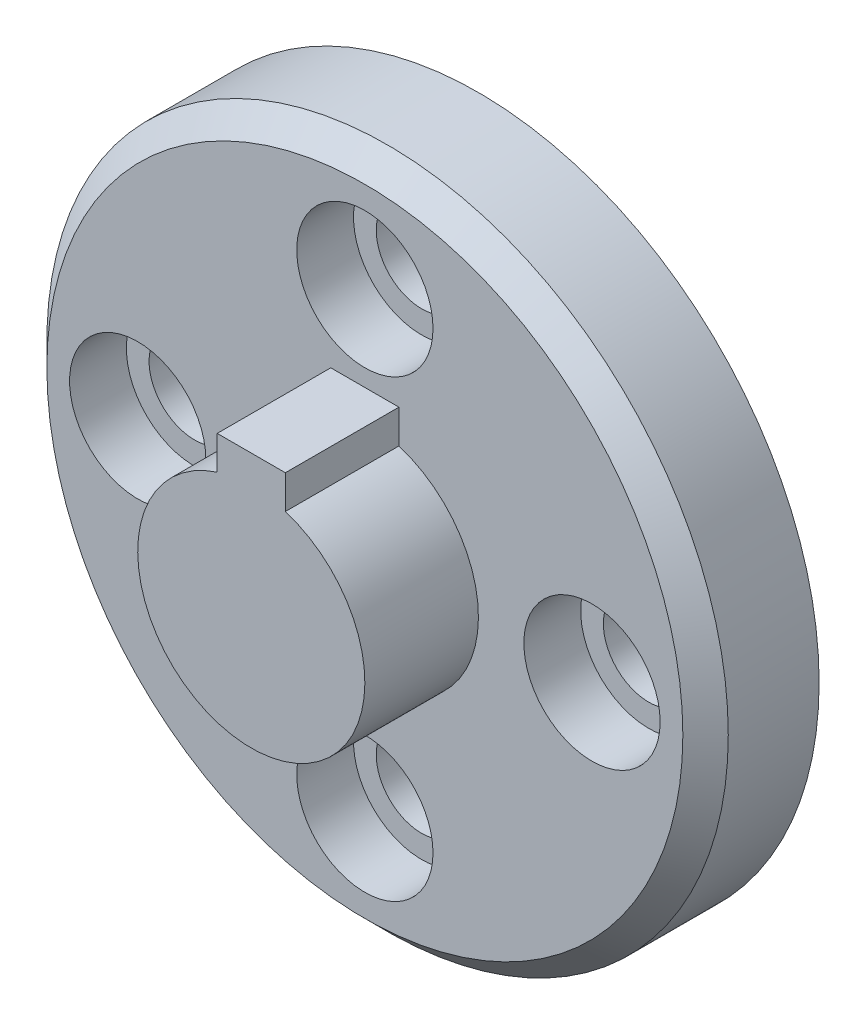
ISO-10303-21;
HEADER;
FILE_DESCRIPTION(('STEP AP214'),'2;1');
FILE_NAME('part.step','',(''),(''),'','','');
FILE_SCHEMA(('AUTOMOTIVE_DESIGN { 1 0 10303 214 1 1 1 1 }'));
ENDSEC;
DATA;
#1=APPLICATION_CONTEXT('core data for automotive mechanical design processes');
#2=APPLICATION_PROTOCOL_DEFINITION('international standard','automotive_design',2000,#1);
#3=PRODUCT_CONTEXT('',#1,'mechanical');
#4=PRODUCT('Part','Part','',(#3));
#5=PRODUCT_RELATED_PRODUCT_CATEGORY('part','',(#4));
#6=PRODUCT_DEFINITION_FORMATION('','',#4);
#7=PRODUCT_DEFINITION_CONTEXT('part definition',#1,'design');
#8=PRODUCT_DEFINITION('design','',#6,#7);
#9=PRODUCT_DEFINITION_SHAPE('','',#8);
#10=(LENGTH_UNIT() NAMED_UNIT(*) SI_UNIT(.MILLI.,.METRE.));
#11=(NAMED_UNIT(*) PLANE_ANGLE_UNIT() SI_UNIT($,.RADIAN.));
#12=(NAMED_UNIT(*) SI_UNIT($,.STERADIAN.) SOLID_ANGLE_UNIT());
#13=UNCERTAINTY_MEASURE_WITH_UNIT(LENGTH_MEASURE(1.E-05),#10,'distance_accuracy_value','');
#14=(GEOMETRIC_REPRESENTATION_CONTEXT(3) GLOBAL_UNCERTAINTY_ASSIGNED_CONTEXT((#13)) GLOBAL_UNIT_ASSIGNED_CONTEXT((#10,
#11,#12)) REPRESENTATION_CONTEXT('',''));
#15=CARTESIAN_POINT('',(0.,0.,0.));
#16=DIRECTION('',(0.,0.,1.));
#17=DIRECTION('',(1.,0.,0.));
#18=AXIS2_PLACEMENT_3D('',#15,#16,#17);
#19=CARTESIAN_POINT('',(0.,10.,5.));
#20=DIRECTION('',(0.,0.,-1.));
#21=DIRECTION('',(-1.,0.,0.));
#22=AXIS2_PLACEMENT_3D('',#19,#20,#21);
#23=CYLINDRICAL_SURFACE('',#22,2.);
#24=CARTESIAN_POINT('',(0.,10.,0.));
#25=DIRECTION('',(0.,0.,1.));
#26=DIRECTION('',(1.,0.,0.));
#27=AXIS2_PLACEMENT_3D('',#24,#25,#26);
#28=CIRCLE('',#27,2.);
#29=CARTESIAN_POINT('',(2.,10.,0.));
#30=VERTEX_POINT('',#29);
#31=EDGE_CURVE('E150',#30,#30,#28,.T.);
#32=ORIENTED_EDGE('',*,*,#31,.F.);
#33=EDGE_LOOP('',(#32));
#34=FACE_BOUND('',#33,.T.);
#35=CARTESIAN_POINT('',(0.,10.,2.5));
#36=DIRECTION('',(0.,0.,1.));
#37=DIRECTION('',(1.,0.,0.));
#38=AXIS2_PLACEMENT_3D('',#35,#36,#37);
#39=CIRCLE('',#38,2.);
#40=CARTESIAN_POINT('',(2.,10.,2.5));
#41=VERTEX_POINT('',#40);
#42=EDGE_CURVE('E124',#41,#41,#39,.T.);
#43=ORIENTED_EDGE('',*,*,#42,.T.);
#44=EDGE_LOOP('',(#43));
#45=FACE_BOUND('',#44,.T.);
#46=ADVANCED_FACE('F47',(#34,#45),#23,.F.);
#47=CARTESIAN_POINT('',(10.,0.,5.));
#48=DIRECTION('',(0.,0.,-1.));
#49=DIRECTION('',(-1.,0.,0.));
#50=AXIS2_PLACEMENT_3D('',#47,#48,#49);
#51=CYLINDRICAL_SURFACE('',#50,2.);
#52=CARTESIAN_POINT('',(10.,0.,0.));
#53=DIRECTION('',(0.,0.,1.));
#54=DIRECTION('',(1.,0.,0.));
#55=AXIS2_PLACEMENT_3D('',#52,#53,#54);
#56=CIRCLE('',#55,2.);
#57=CARTESIAN_POINT('',(12.,0.,0.));
#58=VERTEX_POINT('',#57);
#59=EDGE_CURVE('E146',#58,#58,#56,.T.);
#60=ORIENTED_EDGE('',*,*,#59,.F.);
#61=EDGE_LOOP('',(#60));
#62=FACE_BOUND('',#61,.T.);
#63=CARTESIAN_POINT('',(10.,0.,2.5));
#64=DIRECTION('',(0.,0.,1.));
#65=DIRECTION('',(1.,0.,0.));
#66=AXIS2_PLACEMENT_3D('',#63,#64,#65);
#67=CIRCLE('',#66,2.);
#68=CARTESIAN_POINT('',(12.,0.,2.5));
#69=VERTEX_POINT('',#68);
#70=EDGE_CURVE('E167',#69,#69,#67,.T.);
#71=ORIENTED_EDGE('',*,*,#70,.T.);
#72=EDGE_LOOP('',(#71));
#73=FACE_BOUND('',#72,.T.);
#74=ADVANCED_FACE('F192',(#62,#73),#51,.F.);
#75=CARTESIAN_POINT('',(0.,-10.,5.));
#76=DIRECTION('',(0.,0.,-1.));
#77=DIRECTION('',(-1.,0.,0.));
#78=AXIS2_PLACEMENT_3D('',#75,#76,#77);
#79=CYLINDRICAL_SURFACE('',#78,2.);
#80=CARTESIAN_POINT('',(0.,-10.,0.));
#81=DIRECTION('',(0.,0.,1.));
#82=DIRECTION('',(1.,0.,0.));
#83=AXIS2_PLACEMENT_3D('',#80,#81,#82);
#84=CIRCLE('',#83,2.);
#85=CARTESIAN_POINT('',(1.99999999999993,-10.,0.));
#86=VERTEX_POINT('',#85);
#87=EDGE_CURVE('E142',#86,#86,#84,.T.);
#88=ORIENTED_EDGE('',*,*,#87,.F.);
#89=EDGE_LOOP('',(#88));
#90=FACE_BOUND('',#89,.T.);
#91=CARTESIAN_POINT('',(0.,-10.,2.5));
#92=DIRECTION('',(0.,0.,1.));
#93=DIRECTION('',(1.,0.,0.));
#94=AXIS2_PLACEMENT_3D('',#91,#92,#93);
#95=CIRCLE('',#94,2.);
#96=CARTESIAN_POINT('',(1.99999999999993,-10.,2.5));
#97=VERTEX_POINT('',#96);
#98=EDGE_CURVE('E162',#97,#97,#95,.T.);
#99=ORIENTED_EDGE('',*,*,#98,.T.);
#100=EDGE_LOOP('',(#99));
#101=FACE_BOUND('',#100,.T.);
#102=ADVANCED_FACE('F199',(#90,#101),#79,.F.);
#103=CARTESIAN_POINT('',(-10.,1.04744440165294E-13,5.));
#104=DIRECTION('',(0.,0.,-1.));
#105=DIRECTION('',(-1.,0.,0.));
#106=AXIS2_PLACEMENT_3D('',#103,#104,#105);
#107=CYLINDRICAL_SURFACE('',#106,2.);
#108=CARTESIAN_POINT('',(-10.,1.04744440165294E-13,0.));
#109=DIRECTION('',(0.,0.,1.));
#110=DIRECTION('',(1.,0.,0.));
#111=AXIS2_PLACEMENT_3D('',#108,#109,#110);
#112=CIRCLE('',#111,2.);
#113=CARTESIAN_POINT('',(-8.,1.04744440165294E-13,0.));
#114=VERTEX_POINT('',#113);
#115=EDGE_CURVE('E138',#114,#114,#112,.T.);
#116=ORIENTED_EDGE('',*,*,#115,.F.);
#117=EDGE_LOOP('',(#116));
#118=FACE_BOUND('',#117,.T.);
#119=CARTESIAN_POINT('',(-10.,1.04744440165294E-13,2.5));
#120=DIRECTION('',(0.,0.,1.));
#121=DIRECTION('',(1.,0.,0.));
#122=AXIS2_PLACEMENT_3D('',#119,#120,#121);
#123=CIRCLE('',#122,2.);
#124=CARTESIAN_POINT('',(-8.,1.04744440165294E-13,2.5));
#125=VERTEX_POINT('',#124);
#126=EDGE_CURVE('E158',#125,#125,#123,.T.);
#127=ORIENTED_EDGE('',*,*,#126,.T.);
#128=EDGE_LOOP('',(#127));
#129=FACE_BOUND('',#128,.T.);
#130=ADVANCED_FACE('F209',(#118,#129),#107,.F.);
#131=CARTESIAN_POINT('',(0.,0.,5.));
#132=DIRECTION('',(0.,0.,1.));
#133=DIRECTION('',(1.,0.,0.));
#134=AXIS2_PLACEMENT_3D('',#131,#132,#133);
#135=PLANE('',#134);
#136=CARTESIAN_POINT('',(0.,0.,5.));
#137=DIRECTION('',(0.,0.,1.));
#138=DIRECTION('',(1.,0.,0.));
#139=AXIS2_PLACEMENT_3D('',#136,#137,#138);
#140=CIRCLE('',#139,14.);
#141=CARTESIAN_POINT('',(14.,0.,5.));
#142=VERTEX_POINT('',#141);
#143=EDGE_CURVE('E57',#142,#142,#140,.T.);
#144=ORIENTED_EDGE('',*,*,#143,.T.);
#145=EDGE_LOOP('',(#144));
#146=FACE_BOUND('',#145,.T.);
#147=CARTESIAN_POINT('',(-10.,1.04744440165294E-13,5.));
#148=DIRECTION('',(0.,0.,1.));
#149=DIRECTION('',(1.,0.,0.));
#150=AXIS2_PLACEMENT_3D('',#147,#148,#149);
#151=CIRCLE('',#150,3.);
#152=CARTESIAN_POINT('',(-7.,1.04744440165294E-13,5.));
#153=VERTEX_POINT('',#152);
#154=EDGE_CURVE('E245',#153,#153,#151,.T.);
#155=ORIENTED_EDGE('',*,*,#154,.F.);
#156=EDGE_LOOP('',(#155));
#157=FACE_BOUND('',#156,.T.);
#158=CARTESIAN_POINT('',(1.41393977029702E-13,10.,5.));
#159=DIRECTION('',(0.,0.,1.));
#160=DIRECTION('',(1.,0.,0.));
#161=AXIS2_PLACEMENT_3D('',#158,#159,#160);
#162=CIRCLE('',#161,3.);
#163=CARTESIAN_POINT('',(3.00000000000014,10.,5.));
#164=VERTEX_POINT('',#163);
#165=EDGE_CURVE('E249',#164,#164,#162,.T.);
#166=ORIENTED_EDGE('',*,*,#165,.F.);
#167=EDGE_LOOP('',(#166));
#168=FACE_BOUND('',#167,.T.);
#169=CARTESIAN_POINT('',(10.,-1.74574066942157E-13,5.));
#170=DIRECTION('',(0.,0.,1.));
#171=DIRECTION('',(1.,0.,0.));
#172=AXIS2_PLACEMENT_3D('',#169,#170,#171);
#173=CIRCLE('',#172,3.);
#174=CARTESIAN_POINT('',(13.,-1.74574066942157E-13,5.));
#175=VERTEX_POINT('',#174);
#176=EDGE_CURVE('E259',#175,#175,#173,.T.);
#177=ORIENTED_EDGE('',*,*,#176,.F.);
#178=EDGE_LOOP('',(#177));
#179=FACE_BOUND('',#178,.T.);
#180=CARTESIAN_POINT('',(-2.11223603806565E-13,-10.,5.));
#181=DIRECTION('',(0.,0.,1.));
#182=DIRECTION('',(1.,0.,0.));
#183=AXIS2_PLACEMENT_3D('',#180,#181,#182);
#184=CIRCLE('',#183,3.);
#185=CARTESIAN_POINT('',(2.99999999999979,-10.,5.));
#186=VERTEX_POINT('',#185);
#187=EDGE_CURVE('E267',#186,#186,#184,.T.);
#188=ORIENTED_EDGE('',*,*,#187,.F.);
#189=EDGE_LOOP('',(#188));
#190=FACE_BOUND('',#189,.T.);
#191=DIRECTION('',(0.,1.,0.));
#192=VECTOR('',#191,1.);
#193=CARTESIAN_POINT('',(1.5,6.25,5.));
#194=LINE('',#193,#192);
#195=CARTESIAN_POINT('',(1.5,4.76969600708473,5.));
#196=VERTEX_POINT('',#195);
#197=CARTESIAN_POINT('',(1.5,6.25,5.));
#198=VERTEX_POINT('',#197);
#199=EDGE_CURVE('E106',#196,#198,#194,.T.);
#200=ORIENTED_EDGE('',*,*,#199,.F.);
#201=CARTESIAN_POINT('',(0.,0.,5.));
#202=DIRECTION('',(0.,0.,1.));
#203=DIRECTION('',(1.,0.,0.));
#204=AXIS2_PLACEMENT_3D('',#201,#202,#203);
#205=CIRCLE('',#204,5.);
#206=CARTESIAN_POINT('',(-1.5,4.76969600708473,5.));
#207=VERTEX_POINT('',#206);
#208=EDGE_CURVE('E120',#207,#196,#205,.T.);
#209=ORIENTED_EDGE('',*,*,#208,.F.);
#210=DIRECTION('',(0.,-1.,0.));
#211=VECTOR('',#210,1.);
#212=CARTESIAN_POINT('',(-1.5,6.25,5.));
#213=LINE('',#212,#211);
#214=CARTESIAN_POINT('',(-1.5,6.25,5.));
#215=VERTEX_POINT('',#214);
#216=EDGE_CURVE('E86',#215,#207,#213,.T.);
#217=ORIENTED_EDGE('',*,*,#216,.F.);
#218=DIRECTION('',(-1.,0.,0.));
#219=VECTOR('',#218,1.);
#220=CARTESIAN_POINT('',(-1.5,6.25,5.));
#221=LINE('',#220,#219);
#222=EDGE_CURVE('E127',#198,#215,#221,.T.);
#223=ORIENTED_EDGE('',*,*,#222,.F.);
#224=EDGE_LOOP('',(#200,#209,#217,#223));
#225=FACE_BOUND('',#224,.T.);
#226=ADVANCED_FACE('F177',(#146,#157,#168,#179,#190,#225),#135,.T.);
#227=CARTESIAN_POINT('',(0.,0.,0.));
#228=DIRECTION('',(0.,0.,1.));
#229=DIRECTION('',(1.,0.,0.));
#230=AXIS2_PLACEMENT_3D('',#227,#228,#229);
#231=PLANE('',#230);
#232=CARTESIAN_POINT('',(0.,0.,0.));
#233=DIRECTION('',(0.,0.,1.));
#234=DIRECTION('',(1.,0.,0.));
#235=AXIS2_PLACEMENT_3D('',#232,#233,#234);
#236=CIRCLE('',#235,15.);
#237=CARTESIAN_POINT('',(15.,0.,0.));
#238=VERTEX_POINT('',#237);
#239=EDGE_CURVE('E154',#238,#238,#236,.T.);
#240=ORIENTED_EDGE('',*,*,#239,.F.);
#241=EDGE_LOOP('',(#240));
#242=FACE_BOUND('',#241,.T.);
#243=ORIENTED_EDGE('',*,*,#31,.T.);
#244=EDGE_LOOP('',(#243));
#245=FACE_BOUND('',#244,.T.);
#246=ORIENTED_EDGE('',*,*,#59,.T.);
#247=EDGE_LOOP('',(#246));
#248=FACE_BOUND('',#247,.T.);
#249=ORIENTED_EDGE('',*,*,#87,.T.);
#250=EDGE_LOOP('',(#249));
#251=FACE_BOUND('',#250,.T.);
#252=ORIENTED_EDGE('',*,*,#115,.T.);
#253=EDGE_LOOP('',(#252));
#254=FACE_BOUND('',#253,.T.);
#255=ADVANCED_FACE('F208',(#242,#245,#248,#251,#254),#231,.F.);
#256=CARTESIAN_POINT('',(0.,0.,5.));
#257=DIRECTION('',(0.,0.,-1.));
#258=DIRECTION('',(-1.,0.,0.));
#259=AXIS2_PLACEMENT_3D('',#256,#257,#258);
#260=CYLINDRICAL_SURFACE('',#259,15.);
#261=CARTESIAN_POINT('',(0.,0.,4.));
#262=DIRECTION('',(0.,0.,1.));
#263=DIRECTION('',(1.,0.,0.));
#264=AXIS2_PLACEMENT_3D('',#261,#262,#263);
#265=CIRCLE('',#264,15.);
#266=CARTESIAN_POINT('',(15.,0.,4.));
#267=VERTEX_POINT('',#266);
#268=EDGE_CURVE('E11',#267,#267,#265,.F.);
#269=ORIENTED_EDGE('',*,*,#268,.T.);
#270=EDGE_LOOP('',(#269));
#271=FACE_BOUND('',#270,.T.);
#272=ORIENTED_EDGE('',*,*,#239,.T.);
#273=EDGE_LOOP('',(#272));
#274=FACE_BOUND('',#273,.T.);
#275=ADVANCED_FACE('F211',(#271,#274),#260,.T.);
#276=CARTESIAN_POINT('',(0.,0.,10.));
#277=DIRECTION('',(0.,0.,-1.));
#278=DIRECTION('',(-1.,0.,0.));
#279=AXIS2_PLACEMENT_3D('',#276,#277,#278);
#280=CYLINDRICAL_SURFACE('',#279,5.);
#281=ORIENTED_EDGE('',*,*,#208,.T.);
#282=DIRECTION('',(0.,0.,-1.));
#283=VECTOR('',#282,1.);
#284=CARTESIAN_POINT('',(1.5,4.76969600708473,10.));
#285=LINE('',#284,#283);
#286=CARTESIAN_POINT('',(1.5,4.76969600708473,10.));
#287=VERTEX_POINT('',#286);
#288=EDGE_CURVE('E110',#287,#196,#285,.T.);
#289=ORIENTED_EDGE('',*,*,#288,.F.);
#290=CARTESIAN_POINT('',(0.,0.,10.));
#291=DIRECTION('',(0.,0.,1.));
#292=DIRECTION('',(1.,0.,0.));
#293=AXIS2_PLACEMENT_3D('',#290,#291,#292);
#294=CIRCLE('',#293,5.);
#295=CARTESIAN_POINT('',(-1.5,4.76969600708473,10.));
#296=VERTEX_POINT('',#295);
#297=EDGE_CURVE('E98',#296,#287,#294,.T.);
#298=ORIENTED_EDGE('',*,*,#297,.F.);
#299=DIRECTION('',(0.,0.,-1.));
#300=VECTOR('',#299,1.);
#301=CARTESIAN_POINT('',(-1.5,4.76969600708473,10.));
#302=LINE('',#301,#300);
#303=EDGE_CURVE('E116',#296,#207,#302,.T.);
#304=ORIENTED_EDGE('',*,*,#303,.T.);
#305=EDGE_LOOP('',(#281,#289,#298,#304));
#306=FACE_BOUND('',#305,.T.);
#307=ADVANCED_FACE('F213',(#306),#280,.T.);
#308=CARTESIAN_POINT('',(1.5,6.25,10.));
#309=DIRECTION('',(-1.,0.,0.));
#310=DIRECTION('',(0.,-1.,0.));
#311=AXIS2_PLACEMENT_3D('',#308,#309,#310);
#312=PLANE('',#311);
#313=ORIENTED_EDGE('',*,*,#199,.T.);
#314=DIRECTION('',(0.,0.,-1.));
#315=VECTOR('',#314,1.);
#316=CARTESIAN_POINT('',(1.5,6.25,10.));
#317=LINE('',#316,#315);
#318=CARTESIAN_POINT('',(1.5,6.25,10.));
#319=VERTEX_POINT('',#318);
#320=EDGE_CURVE('E103',#319,#198,#317,.T.);
#321=ORIENTED_EDGE('',*,*,#320,.F.);
#322=DIRECTION('',(0.,1.,0.));
#323=VECTOR('',#322,1.);
#324=CARTESIAN_POINT('',(1.5,6.25,10.));
#325=LINE('',#324,#323);
#326=EDGE_CURVE('E93',#287,#319,#325,.T.);
#327=ORIENTED_EDGE('',*,*,#326,.F.);
#328=ORIENTED_EDGE('',*,*,#288,.T.);
#329=EDGE_LOOP('',(#313,#321,#327,#328));
#330=FACE_BOUND('',#329,.T.);
#331=ADVANCED_FACE('F104',(#330),#312,.F.);
#332=CARTESIAN_POINT('',(-1.5,6.25,10.));
#333=DIRECTION('',(0.,-1.,0.));
#334=DIRECTION('',(0.,0.,-1.));
#335=AXIS2_PLACEMENT_3D('',#332,#333,#334);
#336=PLANE('',#335);
#337=ORIENTED_EDGE('',*,*,#222,.T.);
#338=DIRECTION('',(0.,0.,-1.));
#339=VECTOR('',#338,1.);
#340=CARTESIAN_POINT('',(-1.5,6.25,10.));
#341=LINE('',#340,#339);
#342=CARTESIAN_POINT('',(-1.5,6.25,10.));
#343=VERTEX_POINT('',#342);
#344=EDGE_CURVE('E64',#343,#215,#341,.T.);
#345=ORIENTED_EDGE('',*,*,#344,.F.);
#346=DIRECTION('',(-1.,0.,0.));
#347=VECTOR('',#346,1.);
#348=CARTESIAN_POINT('',(-1.5,6.25,10.));
#349=LINE('',#348,#347);
#350=EDGE_CURVE('E96',#319,#343,#349,.T.);
#351=ORIENTED_EDGE('',*,*,#350,.F.);
#352=ORIENTED_EDGE('',*,*,#320,.T.);
#353=EDGE_LOOP('',(#337,#345,#351,#352));
#354=FACE_BOUND('',#353,.T.);
#355=ADVANCED_FACE('F112',(#354),#336,.F.);
#356=CARTESIAN_POINT('',(-1.5,6.25,10.));
#357=DIRECTION('',(1.,0.,0.));
#358=DIRECTION('',(0.,0.,-1.));
#359=AXIS2_PLACEMENT_3D('',#356,#357,#358);
#360=PLANE('',#359);
#361=ORIENTED_EDGE('',*,*,#216,.T.);
#362=ORIENTED_EDGE('',*,*,#303,.F.);
#363=DIRECTION('',(0.,-1.,0.));
#364=VECTOR('',#363,1.);
#365=CARTESIAN_POINT('',(-1.5,6.25,10.));
#366=LINE('',#365,#364);
#367=EDGE_CURVE('E72',#343,#296,#366,.T.);
#368=ORIENTED_EDGE('',*,*,#367,.F.);
#369=ORIENTED_EDGE('',*,*,#344,.T.);
#370=EDGE_LOOP('',(#361,#362,#368,#369));
#371=FACE_BOUND('',#370,.T.);
#372=ADVANCED_FACE('F286',(#371),#360,.F.);
#373=CARTESIAN_POINT('',(0.,0.,10.));
#374=DIRECTION('',(0.,0.,1.));
#375=DIRECTION('',(1.,0.,0.));
#376=AXIS2_PLACEMENT_3D('',#373,#374,#375);
#377=PLANE('',#376);
#378=ORIENTED_EDGE('',*,*,#297,.T.);
#379=ORIENTED_EDGE('',*,*,#326,.T.);
#380=ORIENTED_EDGE('',*,*,#350,.T.);
#381=ORIENTED_EDGE('',*,*,#367,.T.);
#382=EDGE_LOOP('',(#378,#379,#380,#381));
#383=FACE_BOUND('',#382,.T.);
#384=ADVANCED_FACE('F94',(#383),#377,.T.);
#385=CARTESIAN_POINT('',(-10.,1.04744440165294E-13,2.5));
#386=DIRECTION('',(0.,0.,1.));
#387=DIRECTION('',(1.,0.,0.));
#388=AXIS2_PLACEMENT_3D('',#385,#386,#387);
#389=CYLINDRICAL_SURFACE('',#388,3.);
#390=CARTESIAN_POINT('',(-10.,1.04744440165294E-13,2.5));
#391=DIRECTION('',(0.,0.,1.));
#392=DIRECTION('',(1.,0.,0.));
#393=AXIS2_PLACEMENT_3D('',#390,#391,#392);
#394=CIRCLE('',#393,3.);
#395=CARTESIAN_POINT('',(-7.,1.04744440165294E-13,2.5));
#396=VERTEX_POINT('',#395);
#397=EDGE_CURVE('E163',#396,#396,#394,.T.);
#398=ORIENTED_EDGE('',*,*,#397,.F.);
#399=EDGE_LOOP('',(#398));
#400=FACE_BOUND('',#399,.T.);
#401=ORIENTED_EDGE('',*,*,#154,.T.);
#402=EDGE_LOOP('',(#401));
#403=FACE_BOUND('',#402,.T.);
#404=ADVANCED_FACE('F239',(#400,#403),#389,.F.);
#405=CARTESIAN_POINT('',(-10.,1.04744440165294E-13,2.5));
#406=DIRECTION('',(0.,0.,1.));
#407=DIRECTION('',(1.,0.,0.));
#408=AXIS2_PLACEMENT_3D('',#405,#406,#407);
#409=PLANE('',#408);
#410=ORIENTED_EDGE('',*,*,#126,.F.);
#411=EDGE_LOOP('',(#410));
#412=FACE_BOUND('',#411,.T.);
#413=ORIENTED_EDGE('',*,*,#397,.T.);
#414=EDGE_LOOP('',(#413));
#415=FACE_BOUND('',#414,.T.);
#416=ADVANCED_FACE('F235',(#412,#415),#409,.T.);
#417=CARTESIAN_POINT('',(-2.11223603806565E-13,-10.,2.5));
#418=DIRECTION('',(0.,0.,1.));
#419=DIRECTION('',(1.,0.,0.));
#420=AXIS2_PLACEMENT_3D('',#417,#418,#419);
#421=CYLINDRICAL_SURFACE('',#420,3.);
#422=CARTESIAN_POINT('',(-2.11223603806565E-13,-10.,2.5));
#423=DIRECTION('',(0.,0.,1.));
#424=DIRECTION('',(1.,0.,0.));
#425=AXIS2_PLACEMENT_3D('',#422,#423,#424);
#426=CIRCLE('',#425,3.);
#427=CARTESIAN_POINT('',(2.99999999999979,-10.,2.5));
#428=VERTEX_POINT('',#427);
#429=EDGE_CURVE('E271',#428,#428,#426,.T.);
#430=ORIENTED_EDGE('',*,*,#429,.F.);
#431=EDGE_LOOP('',(#430));
#432=FACE_BOUND('',#431,.T.);
#433=ORIENTED_EDGE('',*,*,#187,.T.);
#434=EDGE_LOOP('',(#433));
#435=FACE_BOUND('',#434,.T.);
#436=ADVANCED_FACE('F238',(#432,#435),#421,.F.);
#437=CARTESIAN_POINT('',(-2.11223603806565E-13,-10.,2.5));
#438=DIRECTION('',(0.,0.,1.));
#439=DIRECTION('',(1.,0.,0.));
#440=AXIS2_PLACEMENT_3D('',#437,#438,#439);
#441=PLANE('',#440);
#442=ORIENTED_EDGE('',*,*,#98,.F.);
#443=EDGE_LOOP('',(#442));
#444=FACE_BOUND('',#443,.T.);
#445=ORIENTED_EDGE('',*,*,#429,.T.);
#446=EDGE_LOOP('',(#445));
#447=FACE_BOUND('',#446,.T.);
#448=ADVANCED_FACE('F277',(#444,#447),#441,.T.);
#449=CARTESIAN_POINT('',(10.,-1.74574066942157E-13,2.5));
#450=DIRECTION('',(0.,0.,1.));
#451=DIRECTION('',(1.,0.,0.));
#452=AXIS2_PLACEMENT_3D('',#449,#450,#451);
#453=CYLINDRICAL_SURFACE('',#452,3.);
#454=CARTESIAN_POINT('',(10.,-1.74574066942157E-13,2.5));
#455=DIRECTION('',(0.,0.,1.));
#456=DIRECTION('',(1.,0.,0.));
#457=AXIS2_PLACEMENT_3D('',#454,#455,#456);
#458=CIRCLE('',#457,3.);
#459=CARTESIAN_POINT('',(13.,-1.74574066942157E-13,2.5));
#460=VERTEX_POINT('',#459);
#461=EDGE_CURVE('E263',#460,#460,#458,.T.);
#462=ORIENTED_EDGE('',*,*,#461,.F.);
#463=EDGE_LOOP('',(#462));
#464=FACE_BOUND('',#463,.T.);
#465=ORIENTED_EDGE('',*,*,#176,.T.);
#466=EDGE_LOOP('',(#465));
#467=FACE_BOUND('',#466,.T.);
#468=ADVANCED_FACE('F305',(#464,#467),#453,.F.);
#469=CARTESIAN_POINT('',(10.,-1.74574066942157E-13,2.5));
#470=DIRECTION('',(0.,0.,1.));
#471=DIRECTION('',(1.,0.,0.));
#472=AXIS2_PLACEMENT_3D('',#469,#470,#471);
#473=PLANE('',#472);
#474=ORIENTED_EDGE('',*,*,#70,.F.);
#475=EDGE_LOOP('',(#474));
#476=FACE_BOUND('',#475,.T.);
#477=ORIENTED_EDGE('',*,*,#461,.T.);
#478=EDGE_LOOP('',(#477));
#479=FACE_BOUND('',#478,.T.);
#480=ADVANCED_FACE('F309',(#476,#479),#473,.T.);
#481=CARTESIAN_POINT('',(1.41393977029702E-13,10.,2.5));
#482=DIRECTION('',(0.,0.,1.));
#483=DIRECTION('',(1.,0.,0.));
#484=AXIS2_PLACEMENT_3D('',#481,#482,#483);
#485=CYLINDRICAL_SURFACE('',#484,3.);
#486=CARTESIAN_POINT('',(1.41393977029702E-13,10.,2.5));
#487=DIRECTION('',(0.,0.,1.));
#488=DIRECTION('',(1.,0.,0.));
#489=AXIS2_PLACEMENT_3D('',#486,#487,#488);
#490=CIRCLE('',#489,3.);
#491=CARTESIAN_POINT('',(3.00000000000014,10.,2.5));
#492=VERTEX_POINT('',#491);
#493=EDGE_CURVE('E255',#492,#492,#490,.T.);
#494=ORIENTED_EDGE('',*,*,#493,.F.);
#495=EDGE_LOOP('',(#494));
#496=FACE_BOUND('',#495,.T.);
#497=ORIENTED_EDGE('',*,*,#165,.T.);
#498=EDGE_LOOP('',(#497));
#499=FACE_BOUND('',#498,.T.);
#500=ADVANCED_FACE('F187',(#496,#499),#485,.F.);
#501=CARTESIAN_POINT('',(1.41393977029702E-13,10.,2.5));
#502=DIRECTION('',(0.,0.,1.));
#503=DIRECTION('',(1.,0.,0.));
#504=AXIS2_PLACEMENT_3D('',#501,#502,#503);
#505=PLANE('',#504);
#506=ORIENTED_EDGE('',*,*,#42,.F.);
#507=EDGE_LOOP('',(#506));
#508=FACE_BOUND('',#507,.T.);
#509=ORIENTED_EDGE('',*,*,#493,.T.);
#510=EDGE_LOOP('',(#509));
#511=FACE_BOUND('',#510,.T.);
#512=ADVANCED_FACE('F181',(#508,#511),#505,.T.);
#513=CARTESIAN_POINT('',(0.,0.,5.));
#514=DIRECTION('',(0.,0.,-1.));
#515=DIRECTION('',(-1.,0.,0.));
#516=AXIS2_PLACEMENT_3D('',#513,#514,#515);
#517=CONICAL_SURFACE('',#516,14.,0.785398163397447);
#518=ORIENTED_EDGE('',*,*,#268,.F.);
#519=EDGE_LOOP('',(#518));
#520=FACE_BOUND('',#519,.T.);
#521=ORIENTED_EDGE('',*,*,#143,.F.);
#522=EDGE_LOOP('',(#521));
#523=FACE_BOUND('',#522,.T.);
#524=ADVANCED_FACE('F50',(#520,#523),#517,.T.);
#525=CLOSED_SHELL('',(#46,#74,#102,#130,#226,#255,#275,#307,#331,#355,#372,#384,#404,#416,#436,
#448,#468,#480,#500,#512,#524));
#526=MANIFOLD_SOLID_BREP('B2',#525);
#527=ADVANCED_BREP_SHAPE_REPRESENTATION('',(#18,#526),#14);
#528=SHAPE_DEFINITION_REPRESENTATION(#9,#527);
ENDSEC;
END-ISO-10303-21;
